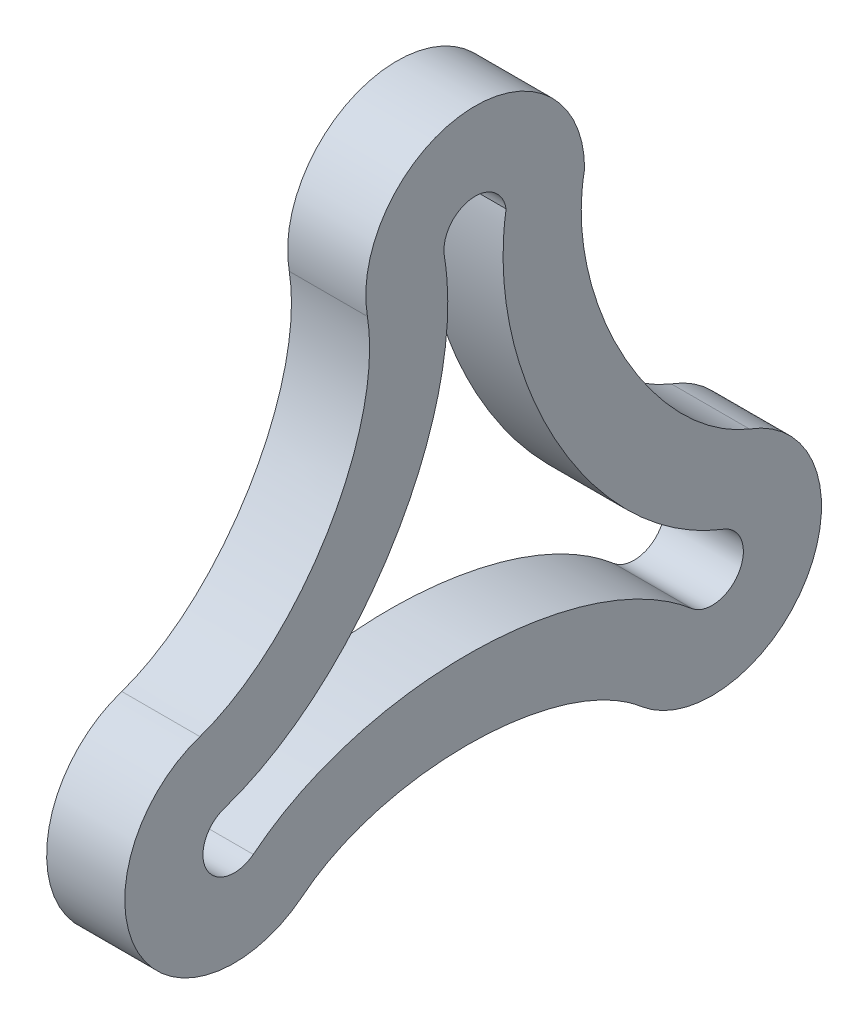
ISO-10303-21;
HEADER;
FILE_DESCRIPTION(('STEP AP214'),'2;1');
FILE_NAME('part.step','',(''),(''),'','','');
FILE_SCHEMA(('AUTOMOTIVE_DESIGN { 1 0 10303 214 1 1 1 1 }'));
ENDSEC;
DATA;
#1=APPLICATION_CONTEXT('core data for automotive mechanical design processes');
#2=APPLICATION_PROTOCOL_DEFINITION('international standard','automotive_design',2000,#1);
#3=PRODUCT_CONTEXT('',#1,'mechanical');
#4=PRODUCT('Part','Part','',(#3));
#5=PRODUCT_RELATED_PRODUCT_CATEGORY('part','',(#4));
#6=PRODUCT_DEFINITION_FORMATION('','',#4);
#7=PRODUCT_DEFINITION_CONTEXT('part definition',#1,'design');
#8=PRODUCT_DEFINITION('design','',#6,#7);
#9=PRODUCT_DEFINITION_SHAPE('','',#8);
#10=(LENGTH_UNIT() NAMED_UNIT(*) SI_UNIT(.MILLI.,.METRE.));
#11=(NAMED_UNIT(*) PLANE_ANGLE_UNIT() SI_UNIT($,.RADIAN.));
#12=(NAMED_UNIT(*) SI_UNIT($,.STERADIAN.) SOLID_ANGLE_UNIT());
#13=UNCERTAINTY_MEASURE_WITH_UNIT(LENGTH_MEASURE(1.E-05),#10,'distance_accuracy_value','');
#14=(GEOMETRIC_REPRESENTATION_CONTEXT(3) GLOBAL_UNCERTAINTY_ASSIGNED_CONTEXT((#13)) GLOBAL_UNIT_ASSIGNED_CONTEXT((#10,
#11,#12)) REPRESENTATION_CONTEXT('',''));
#15=CARTESIAN_POINT('',(0.,0.,0.));
#16=DIRECTION('',(0.,0.,1.));
#17=DIRECTION('',(1.,0.,0.));
#18=AXIS2_PLACEMENT_3D('',#15,#16,#17);
#19=CARTESIAN_POINT('',(10.,-17.4999999999999,-30.3108891324554));
#20=DIRECTION('',(1.,0.,0.));
#21=DIRECTION('',(0.,0.,-1.));
#22=AXIS2_PLACEMENT_3D('',#19,#20,#21);
#23=PLANE('',#22);
#24=CARTESIAN_POINT('',(10.,-17.4999999999999,-30.3108891324554));
#25=DIRECTION('',(1.,0.,0.));
#26=DIRECTION('',(0.,0.,-1.));
#27=AXIS2_PLACEMENT_3D('',#24,#25,#26);
#28=CIRCLE('',#27,14.);
#29=CARTESIAN_POINT('',(10.,-28.2246222036657,-21.311862596844));
#30=VERTEX_POINT('',#29);
#31=CARTESIAN_POINT('',(10.,-4.34430330899716,-35.0991711390147));
#32=VERTEX_POINT('',#31);
#33=EDGE_CURVE('E286',#30,#32,#28,.T.);
#34=ORIENTED_EDGE('',*,*,#33,.T.);
#35=CARTESIAN_POINT('',(10.,-4.34430330899717,-35.0991711390147));
#36=CARTESIAN_POINT('',(10.,0.730320455063931,-22.4095702220826));
#37=CARTESIAN_POINT('',(10.,21.6219834654,-11.2059972480785));
#38=CARTESIAN_POINT('',(10.,35.,-14.));
#39=B_SPLINE_CURVE_WITH_KNOTS('',3,(#35,#36,#37,#38),.UNSPECIFIED.,.F.,.F.,(4,4),(0.,1.),.UNSPECIFIED.);
#40=CARTESIAN_POINT('',(10.,35.,-14.));
#41=VERTEX_POINT('',#40);
#42=EDGE_CURVE('E318',#32,#41,#39,.T.);
#43=ORIENTED_EDGE('',*,*,#42,.T.);
#44=CARTESIAN_POINT('',(10.,35.,0.));
#45=DIRECTION('',(1.,0.,0.));
#46=DIRECTION('',(0.,0.,-1.));
#47=AXIS2_PLACEMENT_3D('',#44,#45,#46);
#48=CIRCLE('',#47,14.);
#49=CARTESIAN_POINT('',(10.,32.5689255126631,13.7873085421709));
#50=VERTEX_POINT('',#49);
#51=EDGE_CURVE('E305',#41,#50,#48,.T.);
#52=ORIENTED_EDGE('',*,*,#51,.T.);
#53=CARTESIAN_POINT('',(10.,-3.27085917525937,35.2154265364205));
#54=CARTESIAN_POINT('',(10.,1.20683735372193,22.303106389672));
#55=CARTESIAN_POINT('',(10.,19.0752286803663,11.6198391477293));
#56=CARTESIAN_POINT('',(10.,32.5689255126631,13.7873085421709));
#57=B_SPLINE_CURVE_WITH_KNOTS('',3,(#53,#54,#55,#56),.UNSPECIFIED.,.F.,.F.,(4,4),(0.,1.),.UNSPECIFIED.);
#58=CARTESIAN_POINT('',(10.,-3.27085917525937,35.2154265364205));
#59=VERTEX_POINT('',#58);
#60=EDGE_CURVE('E317',#59,#50,#57,.T.);
#61=ORIENTED_EDGE('',*,*,#60,.F.);
#62=CARTESIAN_POINT('',(10.,-16.5665898468168,30.8309601025876));
#63=DIRECTION('',(1.,0.,0.));
#64=DIRECTION('',(0.,0.,-1.));
#65=AXIS2_PLACEMENT_3D('',#62,#63,#64);
#66=CIRCLE('',#65,14.);
#67=CARTESIAN_POINT('',(10.,-27.56091400873,22.1635016387257));
#68=VERTEX_POINT('',#67);
#69=EDGE_CURVE('E255',#59,#68,#66,.T.);
#70=ORIENTED_EDGE('',*,*,#69,.T.);
#71=CARTESIAN_POINT('',(10.,-27.56091400873,22.1635016387257));
#72=CARTESIAN_POINT('',(10.,-18.9369820350699,11.5613520882118));
#73=CARTESIAN_POINT('',(10.,-19.2810731992745,-10.9779035789346));
#74=CARTESIAN_POINT('',(10.,-28.2246222036657,-21.311862596844));
#75=B_SPLINE_CURVE_WITH_KNOTS('',3,(#71,#72,#73,#74),.UNSPECIFIED.,.F.,.F.,(4,4),(0.,1.),.UNSPECIFIED.);
#76=EDGE_CURVE('E248',#68,#30,#75,.T.);
#77=ORIENTED_EDGE('',*,*,#76,.T.);
#78=EDGE_LOOP('',(#34,#43,#52,#61,#70,#77));
#79=FACE_BOUND('',#78,.T.);
#80=CARTESIAN_POINT('',(10.,-13.7052692722452,-31.5758075898408));
#81=CARTESIAN_POINT('',(10.,-13.5874261705025,-31.2811292055005));
#82=CARTESIAN_POINT('',(10.,-13.4682761810974,-30.9872777788818));
#83=CARTESIAN_POINT('',(10.,-13.2184869421537,-30.4068449708491));
#84=CARTESIAN_POINT('',(10.,-13.089187261214,-30.1194159522368));
#85=CARTESIAN_POINT('',(10.,-12.6886548150519,-29.2651229197161));
#86=CARTESIAN_POINT('',(10.,-12.4048049911812,-28.7062425867111));
#87=CARTESIAN_POINT('',(10.,-11.5067548924121,-27.0590257331627));
#88=CARTESIAN_POINT('',(10.,-10.84623330075,-25.999999896066));
#89=CARTESIAN_POINT('',(10.,-9.41738617719187,-23.9501631904281));
#90=CARTESIAN_POINT('',(10.,-8.64900229934688,-22.9593892413824));
#91=CARTESIAN_POINT('',(10.,-7.42348885495161,-21.5193809720151));
#92=CARTESIAN_POINT('',(10.,-7.00185447212498,-21.0461438813988));
#93=CARTESIAN_POINT('',(10.,-6.14287553165541,-20.1225468862931));
#94=CARTESIAN_POINT('',(10.,-5.70494021205501,-19.6713984582847));
#95=CARTESIAN_POINT('',(10.,-3.47602794125339,-17.4651318210425));
#96=CARTESIAN_POINT('',(10.,-1.56915187125181,-15.8561603901757));
#97=CARTESIAN_POINT('',(10.,1.44455982104537,-13.6361349405478));
#98=CARTESIAN_POINT('',(10.,2.47505132772029,-12.9288123162899));
#99=CARTESIAN_POINT('',(10.,4.05832959636734,-11.9151669405874));
#100=CARTESIAN_POINT('',(10.,4.59236202819255,-11.585195304149));
#101=CARTESIAN_POINT('',(10.,5.67293994000162,-10.941030767943));
#102=CARTESIAN_POINT('',(10.,6.22037791384543,-10.626358791773));
#103=CARTESIAN_POINT('',(10.,8.97451841022677,-9.10065630520394));
#104=CARTESIAN_POINT('',(10.,11.2342999253311,-8.02825132753051));
#105=CARTESIAN_POINT('',(10.,15.8684741057094,-6.18414459023827));
#106=CARTESIAN_POINT('',(10.,18.2426643794832,-5.41191181967238));
#107=CARTESIAN_POINT('',(10.,21.9061436763009,-4.52168692911069));
#108=CARTESIAN_POINT('',(10.,23.149488575624,-4.26962483275659));
#109=CARTESIAN_POINT('',(10.,25.6329949348202,-3.87613333368429));
#110=CARTESIAN_POINT('',(10.,26.8765673735458,-3.73346968841901));
#111=CARTESIAN_POINT('',(10.,29.3677535157308,-3.56827926976113));
#112=CARTESIAN_POINT('',(10.,30.6153649776108,-3.54568585972204));
#113=CARTESIAN_POINT('',(10.,33.1152291104769,-3.63847078375298));
#114=CARTESIAN_POINT('',(10.,34.3674770834453,-3.7537094572949));
#115=CARTESIAN_POINT('',(10.,35.622494125599,-3.95126575461519));
#116=B_SPLINE_CURVE_WITH_KNOTS('',3,(#80,#81,#82,#83,#84,#85,#86,#87,#88,#89,#90,#91,#92,#93,
#94,#95,#96,#97,#98,#99,#100,#101,#102,#103,#104,#105,#106,#107,#108,#109,#110,#111,#112,#113,
#114,#115),.UNSPECIFIED.,.F.,.F.,(4,2,2,2,2,2,2,2,2,2,2,2,2,2,2,2,2,4),(0.,0.0156249999999999,
0.0312499999999999,0.0624999999999999,0.125,0.1875,0.21875,0.25,0.375,0.4375,0.46875,0.5,0.625,
0.75,0.8125,0.875,0.9375,1.),.UNSPECIFIED.);
#117=CARTESIAN_POINT('',(10.,-13.7052692722452,-31.5758075898408));
#118=VERTEX_POINT('',#117);
#119=CARTESIAN_POINT('',(10.,35.622494125599,-3.95126575461519));
#120=VERTEX_POINT('',#119);
#121=EDGE_CURVE('E202',#118,#120,#116,.T.);
#122=ORIENTED_EDGE('',*,*,#121,.F.);
#123=CARTESIAN_POINT('',(10.,-17.4999999999999,-30.3108891324554));
#124=DIRECTION('',(1.,0.,0.));
#125=DIRECTION('',(0.,0.,-1.));
#126=AXIS2_PLACEMENT_3D('',#123,#124,#125);
#127=CIRCLE('',#126,4.);
#128=CARTESIAN_POINT('',(10.,-20.5936737407594,-27.7753058098775));
#129=VERTEX_POINT('',#128);
#130=EDGE_CURVE('E194',#129,#118,#127,.T.);
#131=ORIENTED_EDGE('',*,*,#130,.F.);
#132=CARTESIAN_POINT('',(10.,-19.7362218405777,28.3909943191949));
#133=CARTESIAN_POINT('',(10.,-18.9389145172402,27.4035076018071));
#134=CARTESIAN_POINT('',(10.,-18.2152920064089,26.3772814997736));
#135=CARTESIAN_POINT('',(10.,-16.893290998247,24.2589829448976));
#136=CARTESIAN_POINT('',(10.,-16.2950248439182,23.1668514283402));
#137=CARTESIAN_POINT('',(10.,-15.2092160835599,20.9243760990818));
#138=CARTESIAN_POINT('',(10.,-14.7217263120189,19.7740045089392));
#139=CARTESIAN_POINT('',(10.,-13.8478224334519,17.4201213543122));
#140=CARTESIAN_POINT('',(10.,-13.4607731890551,16.2126291843441));
#141=CARTESIAN_POINT('',(10.,-12.4587129290554,12.5832798578116));
#142=CARTESIAN_POINT('',(10.,-11.9918108184128,10.13497447388));
#143=CARTESIAN_POINT('',(10.,-11.3960017744614,5.19007001430639));
#144=CARTESIAN_POINT('',(10.,-11.2676573885535,2.69336129936687));
#145=CARTESIAN_POINT('',(10.,-11.3445899209126,-2.34760780342556));
#146=CARTESIAN_POINT('',(10.,-11.5490508115374,-4.83849144421632));
#147=CARTESIAN_POINT('',(10.,-12.2948635088509,-9.76018281717416));
#148=CARTESIAN_POINT('',(10.,-12.8356758023513,-12.1910867577679));
#149=CARTESIAN_POINT('',(10.,-13.7609661499659,-15.1852648439058));
#150=CARTESIAN_POINT('',(10.,-13.9586622088413,-15.7818467978336));
#151=CARTESIAN_POINT('',(10.,-14.3811200976377,-16.9701842152421));
#152=CARTESIAN_POINT('',(10.,-14.6057464166481,-17.5612990935115));
#153=CARTESIAN_POINT('',(10.,-15.3155422227981,-19.3089144906857));
#154=CARTESIAN_POINT('',(10.,-15.8384817686497,-20.4455226953782));
#155=CARTESIAN_POINT('',(10.,-16.9932872852116,-22.6563979178249));
#156=CARTESIAN_POINT('',(10.,-17.6251027310442,-23.7306938521696));
#157=CARTESIAN_POINT('',(10.,-19.0118523586382,-25.8088219363171));
#158=CARTESIAN_POINT('',(10.,-19.7666788532751,-26.8127157180257));
#159=CARTESIAN_POINT('',(10.,-20.5936737407594,-27.7753058098775));
#160=B_SPLINE_CURVE_WITH_KNOTS('',3,(#132,#133,#134,#135,#136,#137,#138,#139,#140,#141,#142,
#143,#144,#145,#146,#147,#148,#149,#150,#151,#152,#153,#154,#155,#156,#157,#158,#159),
.UNSPECIFIED.,.F.,.F.,(4,2,2,2,2,2,2,2,2,2,2,2,2,4),(0.,0.0625,0.125,0.1875,0.25,0.375,0.5,
0.625,0.75,0.78125,0.8125,0.875,0.9375,1.),.UNSPECIFIED.);
#161=CARTESIAN_POINT('',(10.,-19.7362218405777,28.3909943191949));
#162=VERTEX_POINT('',#161);
#163=EDGE_CURVE('E348',#162,#129,#160,.T.);
#164=ORIENTED_EDGE('',*,*,#163,.F.);
#165=CARTESIAN_POINT('',(10.,-16.5665898468168,30.8309601025876));
#166=DIRECTION('',(1.,0.,0.));
#167=DIRECTION('',(0.,0.,-1.));
#168=AXIS2_PLACEMENT_3D('',#165,#166,#167);
#169=CIRCLE('',#168,4.);
#170=CARTESIAN_POINT('',(10.,-12.7514923672908,32.0330546170557));
#171=VERTEX_POINT('',#170);
#172=EDGE_CURVE('E381',#171,#162,#169,.T.);
#173=ORIENTED_EDGE('',*,*,#172,.F.);
#174=CARTESIAN_POINT('',(10.,-12.7514923672908,32.0330546170557));
#175=CARTESIAN_POINT('',(10.,-12.5482065358327,31.4468398702333));
#176=CARTESIAN_POINT('',(10.,-12.3317614082213,30.8680948806678));
#177=CARTESIAN_POINT('',(10.,-11.8647636751303,29.7299657075673));
#178=CARTESIAN_POINT('',(10.,-11.6158342946796,29.1696601148022));
#179=CARTESIAN_POINT('',(10.,-10.8255081795343,27.5134572795555));
#180=CARTESIAN_POINT('',(10.,-10.2407073697815,26.4421979736984));
#181=CARTESIAN_POINT('',(10.,-8.96610989970284,24.3592793214071));
#182=CARTESIAN_POINT('',(10.,-8.27627923600239,23.3476392766857));
#183=CARTESIAN_POINT('',(10.,-6.79844815972391,21.3800843708354));
#184=CARTESIAN_POINT('',(10.,-6.00796920776748,20.422169604364));
#185=CARTESIAN_POINT('',(10.,-3.54451683968055,17.6799653542965));
#186=CARTESIAN_POINT('',(10.,-1.76776735111077,16.0064434777541));
#187=CARTESIAN_POINT('',(10.,1.07218618201035,13.6972133099663));
#188=CARTESIAN_POINT('',(10.,2.04830285892622,12.961355068118));
#189=CARTESIAN_POINT('',(10.,3.55592885222555,11.907536069427));
#190=CARTESIAN_POINT('',(10.,4.06572915694267,11.5646100793356));
#191=CARTESIAN_POINT('',(10.,5.09992148368445,10.8955384865642));
#192=CARTESIAN_POINT('',(10.,5.62511375104993,10.5689505705102));
#193=CARTESIAN_POINT('',(10.,8.26890950668344,8.98966977178995));
#194=CARTESIAN_POINT('',(10.,10.4516400001605,7.88808838450245));
#195=CARTESIAN_POINT('',(10.,14.9542623755349,6.01285247963076));
#196=CARTESIAN_POINT('',(10.,17.2739559899554,5.23872394210704));
#197=CARTESIAN_POINT('',(10.,20.2738745993184,4.51086535482948));
#198=CARTESIAN_POINT('',(10.,20.878420025379,4.37765441628988));
#199=CARTESIAN_POINT('',(10.,22.0857486138527,4.13917175307562));
#200=CARTESIAN_POINT('',(10.,22.6900009007586,4.03352769763858));
#201=CARTESIAN_POINT('',(10.,24.5045671236393,3.75843686425796));
#202=CARTESIAN_POINT('',(10.,25.716684835144,3.63070222886217));
#203=CARTESIAN_POINT('',(10.,28.1461008506974,3.49503368222912));
#204=CARTESIAN_POINT('',(10.,29.3633972696921,3.48705617929199));
#205=CARTESIAN_POINT('',(10.,31.1936512411382,3.57474308273423));
#206=CARTESIAN_POINT('',(10.,31.8044558498974,3.62062086505208));
#207=CARTESIAN_POINT('',(10.,33.0276011544735,3.747898301046));
#208=CARTESIAN_POINT('',(10.,33.6400228653645,3.83117142082494));
#209=CARTESIAN_POINT('',(10.,34.2531020813194,3.92964928448718));
#210=B_SPLINE_CURVE_WITH_KNOTS('',3,(#174,#175,#176,#177,#178,#179,#180,#181,#182,#183,#184,
#185,#186,#187,#188,#189,#190,#191,#192,#193,#194,#195,#196,#197,#198,#199,#200,#201,#202,#203,
#204,#205,#206,#207,#208,#209),.UNSPECIFIED.,.F.,.F.,(4,2,2,2,2,2,2,2,2,2,2,2,2,2,2,2,2,4),(0.,
0.0312500000000002,0.0625000000000003,0.125,0.187500000000001,0.250000000000001,
0.375000000000001,0.437500000000001,0.468750000000001,0.500000000000001,0.625000000000001,
0.750000000000001,0.781250000000001,0.812500000000001,0.875000000000001,0.9375,0.96875,1.),.UNSPECIFIED.);
#211=CARTESIAN_POINT('',(10.,34.2531020813194,3.92964928448718));
#212=VERTEX_POINT('',#211);
#213=EDGE_CURVE('E217',#171,#212,#210,.T.);
#214=ORIENTED_EDGE('',*,*,#213,.T.);
#215=CARTESIAN_POINT('',(10.,35.,0.));
#216=DIRECTION('',(1.,0.,0.));
#217=DIRECTION('',(0.,0.,-1.));
#218=AXIS2_PLACEMENT_3D('',#215,#216,#217);
#219=CIRCLE('',#218,4.);
#220=EDGE_CURVE('E215',#120,#212,#219,.T.);
#221=ORIENTED_EDGE('',*,*,#220,.F.);
#222=EDGE_LOOP('',(#122,#131,#164,#173,#214,#221));
#223=FACE_BOUND('',#222,.T.);
#224=ADVANCED_FACE('F105',(#79,#223),#23,.T.);
#225=CARTESIAN_POINT('',(0.,-17.4999999999999,-30.3108891324554));
#226=DIRECTION('',(1.,0.,0.));
#227=DIRECTION('',(0.,0.,-1.));
#228=AXIS2_PLACEMENT_3D('',#225,#226,#227);
#229=PLANE('',#228);
#230=CARTESIAN_POINT('',(0.,-17.4999999999999,-30.3108891324554));
#231=DIRECTION('',(1.,0.,0.));
#232=DIRECTION('',(0.,0.,-1.));
#233=AXIS2_PLACEMENT_3D('',#230,#231,#232);
#234=CIRCLE('',#233,14.);
#235=CARTESIAN_POINT('',(0.,-28.2246222036657,-21.311862596844));
#236=VERTEX_POINT('',#235);
#237=CARTESIAN_POINT('',(0.,-4.34430330899716,-35.0991711390147));
#238=VERTEX_POINT('',#237);
#239=EDGE_CURVE('E210',#236,#238,#234,.T.);
#240=ORIENTED_EDGE('',*,*,#239,.F.);
#241=CARTESIAN_POINT('',(0.,-27.56091400873,22.1635016387257));
#242=CARTESIAN_POINT('',(0.,-18.9369820350699,11.5613520882118));
#243=CARTESIAN_POINT('',(0.,-19.2810731992745,-10.9779035789346));
#244=CARTESIAN_POINT('',(0.,-28.2246222036657,-21.311862596844));
#245=B_SPLINE_CURVE_WITH_KNOTS('',3,(#241,#242,#243,#244),.UNSPECIFIED.,.F.,.F.,(4,4),(0.,1.),.UNSPECIFIED.);
#246=CARTESIAN_POINT('',(0.,-27.56091400873,22.1635016387257));
#247=VERTEX_POINT('',#246);
#248=EDGE_CURVE('E282',#247,#236,#245,.T.);
#249=ORIENTED_EDGE('',*,*,#248,.F.);
#250=CARTESIAN_POINT('',(0.,-16.5665898468168,30.8309601025876));
#251=DIRECTION('',(1.,0.,0.));
#252=DIRECTION('',(0.,0.,-1.));
#253=AXIS2_PLACEMENT_3D('',#250,#251,#252);
#254=CIRCLE('',#253,14.);
#255=CARTESIAN_POINT('',(0.,-3.27085917525937,35.2154265364205));
#256=VERTEX_POINT('',#255);
#257=EDGE_CURVE('E277',#256,#247,#254,.T.);
#258=ORIENTED_EDGE('',*,*,#257,.F.);
#259=CARTESIAN_POINT('',(0.,-3.27085917525937,35.2154265364205));
#260=CARTESIAN_POINT('',(0.,1.20683735372193,22.303106389672));
#261=CARTESIAN_POINT('',(0.,19.0752286803663,11.6198391477293));
#262=CARTESIAN_POINT('',(0.,32.5689255126631,13.7873085421709));
#263=B_SPLINE_CURVE_WITH_KNOTS('',3,(#259,#260,#261,#262),.UNSPECIFIED.,.F.,.F.,(4,4),(0.,1.),.UNSPECIFIED.);
#264=CARTESIAN_POINT('',(0.,32.5689255126631,13.7873085421709));
#265=VERTEX_POINT('',#264);
#266=EDGE_CURVE('E272',#256,#265,#263,.T.);
#267=ORIENTED_EDGE('',*,*,#266,.T.);
#268=CARTESIAN_POINT('',(0.,35.,0.));
#269=DIRECTION('',(1.,0.,0.));
#270=DIRECTION('',(0.,0.,-1.));
#271=AXIS2_PLACEMENT_3D('',#268,#269,#270);
#272=CIRCLE('',#271,14.);
#273=CARTESIAN_POINT('',(0.,35.,-14.));
#274=VERTEX_POINT('',#273);
#275=EDGE_CURVE('E266',#274,#265,#272,.T.);
#276=ORIENTED_EDGE('',*,*,#275,.F.);
#277=CARTESIAN_POINT('',(0.,-4.34430330899717,-35.0991711390147));
#278=CARTESIAN_POINT('',(0.,0.730320455063931,-22.4095702220826));
#279=CARTESIAN_POINT('',(0.,21.6219834654,-11.2059972480785));
#280=CARTESIAN_POINT('',(0.,35.,-14.));
#281=B_SPLINE_CURVE_WITH_KNOTS('',3,(#277,#278,#279,#280),.UNSPECIFIED.,.F.,.F.,(4,4),(0.,1.),.UNSPECIFIED.);
#282=EDGE_CURVE('E262',#238,#274,#281,.T.);
#283=ORIENTED_EDGE('',*,*,#282,.F.);
#284=EDGE_LOOP('',(#240,#249,#258,#267,#276,#283));
#285=FACE_BOUND('',#284,.T.);
#286=CARTESIAN_POINT('',(0.,-17.4999999999999,-30.3108891324554));
#287=DIRECTION('',(1.,0.,0.));
#288=DIRECTION('',(0.,0.,-1.));
#289=AXIS2_PLACEMENT_3D('',#286,#287,#288);
#290=CIRCLE('',#289,4.);
#291=CARTESIAN_POINT('',(0.,-20.5936737407594,-27.7753058098775));
#292=VERTEX_POINT('',#291);
#293=CARTESIAN_POINT('',(0.,-13.7052692722452,-31.5758075898408));
#294=VERTEX_POINT('',#293);
#295=EDGE_CURVE('E128',#292,#294,#290,.T.);
#296=ORIENTED_EDGE('',*,*,#295,.T.);
#297=CARTESIAN_POINT('',(0.,-13.7052692722452,-31.5758075898408));
#298=CARTESIAN_POINT('',(0.,-13.5874261705025,-31.2811292055005));
#299=CARTESIAN_POINT('',(0.,-13.4682761810974,-30.9872777788818));
#300=CARTESIAN_POINT('',(0.,-13.2184869421537,-30.4068449708491));
#301=CARTESIAN_POINT('',(0.,-13.089187261214,-30.1194159522368));
#302=CARTESIAN_POINT('',(0.,-12.6886548150519,-29.2651229197161));
#303=CARTESIAN_POINT('',(0.,-12.4048049911812,-28.7062425867111));
#304=CARTESIAN_POINT('',(0.,-11.5067548924121,-27.0590257331627));
#305=CARTESIAN_POINT('',(0.,-10.84623330075,-25.999999896066));
#306=CARTESIAN_POINT('',(0.,-9.41738617719187,-23.9501631904281));
#307=CARTESIAN_POINT('',(0.,-8.64900229934688,-22.9593892413824));
#308=CARTESIAN_POINT('',(0.,-7.42348885495161,-21.5193809720151));
#309=CARTESIAN_POINT('',(0.,-7.00185447212498,-21.0461438813988));
#310=CARTESIAN_POINT('',(0.,-6.14287553165541,-20.1225468862931));
#311=CARTESIAN_POINT('',(0.,-5.70494021205501,-19.6713984582847));
#312=CARTESIAN_POINT('',(0.,-3.47602794125339,-17.4651318210425));
#313=CARTESIAN_POINT('',(0.,-1.56915187125181,-15.8561603901757));
#314=CARTESIAN_POINT('',(0.,1.44455982104537,-13.6361349405478));
#315=CARTESIAN_POINT('',(0.,2.47505132772029,-12.9288123162899));
#316=CARTESIAN_POINT('',(0.,4.05832959636734,-11.9151669405874));
#317=CARTESIAN_POINT('',(0.,4.59236202819255,-11.585195304149));
#318=CARTESIAN_POINT('',(0.,5.67293994000162,-10.941030767943));
#319=CARTESIAN_POINT('',(0.,6.22037791384543,-10.626358791773));
#320=CARTESIAN_POINT('',(0.,8.97451841022677,-9.10065630520394));
#321=CARTESIAN_POINT('',(0.,11.2342999253311,-8.02825132753051));
#322=CARTESIAN_POINT('',(0.,15.8684741057094,-6.18414459023827));
#323=CARTESIAN_POINT('',(0.,18.2426643794832,-5.41191181967238));
#324=CARTESIAN_POINT('',(0.,21.9061436763009,-4.52168692911069));
#325=CARTESIAN_POINT('',(0.,23.149488575624,-4.26962483275659));
#326=CARTESIAN_POINT('',(0.,25.6329949348202,-3.87613333368429));
#327=CARTESIAN_POINT('',(0.,26.8765673735458,-3.73346968841901));
#328=CARTESIAN_POINT('',(0.,29.3677535157308,-3.56827926976113));
#329=CARTESIAN_POINT('',(0.,30.6153649776108,-3.54568585972204));
#330=CARTESIAN_POINT('',(0.,33.1152291104769,-3.63847078375298));
#331=CARTESIAN_POINT('',(0.,34.3674770834453,-3.7537094572949));
#332=CARTESIAN_POINT('',(0.,35.622494125599,-3.95126575461519));
#333=B_SPLINE_CURVE_WITH_KNOTS('',3,(#297,#298,#299,#300,#301,#302,#303,#304,#305,#306,#307,
#308,#309,#310,#311,#312,#313,#314,#315,#316,#317,#318,#319,#320,#321,#322,#323,#324,#325,#326,
#327,#328,#329,#330,#331,#332),.UNSPECIFIED.,.F.,.F.,(4,2,2,2,2,2,2,2,2,2,2,2,2,2,2,2,2,4),(0.,
0.0156249999999999,0.0312499999999999,0.0624999999999999,0.125,0.1875,0.21875,0.25,0.375,0.4375,
0.46875,0.5,0.625,0.75,0.8125,0.875,0.9375,1.),.UNSPECIFIED.);
#334=CARTESIAN_POINT('',(0.,35.622494125599,-3.95126575461519));
#335=VERTEX_POINT('',#334);
#336=EDGE_CURVE('E209',#294,#335,#333,.T.);
#337=ORIENTED_EDGE('',*,*,#336,.T.);
#338=CARTESIAN_POINT('',(0.,35.,0.));
#339=DIRECTION('',(1.,0.,0.));
#340=DIRECTION('',(0.,0.,-1.));
#341=AXIS2_PLACEMENT_3D('',#338,#339,#340);
#342=CIRCLE('',#341,4.);
#343=CARTESIAN_POINT('',(0.,34.2531020813194,3.92964928448718));
#344=VERTEX_POINT('',#343);
#345=EDGE_CURVE('E364',#335,#344,#342,.T.);
#346=ORIENTED_EDGE('',*,*,#345,.T.);
#347=CARTESIAN_POINT('',(0.,-12.7514923672908,32.0330546170557));
#348=CARTESIAN_POINT('',(0.,-12.5482065358327,31.4468398702333));
#349=CARTESIAN_POINT('',(0.,-12.3317614082213,30.8680948806678));
#350=CARTESIAN_POINT('',(0.,-11.8647636751303,29.7299657075673));
#351=CARTESIAN_POINT('',(0.,-11.6158342946796,29.1696601148022));
#352=CARTESIAN_POINT('',(0.,-10.8255081795343,27.5134572795555));
#353=CARTESIAN_POINT('',(0.,-10.2407073697815,26.4421979736984));
#354=CARTESIAN_POINT('',(0.,-8.96610989970284,24.3592793214071));
#355=CARTESIAN_POINT('',(0.,-8.27627923600239,23.3476392766857));
#356=CARTESIAN_POINT('',(0.,-6.79844815972391,21.3800843708354));
#357=CARTESIAN_POINT('',(0.,-6.00796920776748,20.422169604364));
#358=CARTESIAN_POINT('',(0.,-3.54451683968055,17.6799653542965));
#359=CARTESIAN_POINT('',(0.,-1.76776735111077,16.0064434777541));
#360=CARTESIAN_POINT('',(0.,1.07218618201035,13.6972133099663));
#361=CARTESIAN_POINT('',(0.,2.04830285892622,12.961355068118));
#362=CARTESIAN_POINT('',(0.,3.55592885222555,11.907536069427));
#363=CARTESIAN_POINT('',(0.,4.06572915694267,11.5646100793356));
#364=CARTESIAN_POINT('',(0.,5.09992148368445,10.8955384865642));
#365=CARTESIAN_POINT('',(0.,5.62511375104993,10.5689505705102));
#366=CARTESIAN_POINT('',(0.,8.26890950668344,8.98966977178995));
#367=CARTESIAN_POINT('',(0.,10.4516400001605,7.88808838450245));
#368=CARTESIAN_POINT('',(0.,14.9542623755349,6.01285247963076));
#369=CARTESIAN_POINT('',(0.,17.2739559899554,5.23872394210704));
#370=CARTESIAN_POINT('',(0.,20.2738745993184,4.51086535482948));
#371=CARTESIAN_POINT('',(0.,20.878420025379,4.37765441628988));
#372=CARTESIAN_POINT('',(0.,22.0857486138527,4.13917175307562));
#373=CARTESIAN_POINT('',(0.,22.6900009007586,4.03352769763858));
#374=CARTESIAN_POINT('',(0.,24.5045671236393,3.75843686425796));
#375=CARTESIAN_POINT('',(0.,25.716684835144,3.63070222886217));
#376=CARTESIAN_POINT('',(0.,28.1461008506974,3.49503368222912));
#377=CARTESIAN_POINT('',(0.,29.3633972696921,3.48705617929199));
#378=CARTESIAN_POINT('',(0.,31.1936512411382,3.57474308273423));
#379=CARTESIAN_POINT('',(0.,31.8044558498974,3.62062086505208));
#380=CARTESIAN_POINT('',(0.,33.0276011544735,3.747898301046));
#381=CARTESIAN_POINT('',(0.,33.6400228653645,3.83117142082494));
#382=CARTESIAN_POINT('',(0.,34.2531020813194,3.92964928448718));
#383=B_SPLINE_CURVE_WITH_KNOTS('',3,(#347,#348,#349,#350,#351,#352,#353,#354,#355,#356,#357,
#358,#359,#360,#361,#362,#363,#364,#365,#366,#367,#368,#369,#370,#371,#372,#373,#374,#375,#376,
#377,#378,#379,#380,#381,#382),.UNSPECIFIED.,.F.,.F.,(4,2,2,2,2,2,2,2,2,2,2,2,2,2,2,2,2,4),(0.,
0.0312500000000002,0.0625000000000003,0.125,0.187500000000001,0.250000000000001,
0.375000000000001,0.437500000000001,0.468750000000001,0.500000000000001,0.625000000000001,
0.750000000000001,0.781250000000001,0.812500000000001,0.875000000000001,0.9375,0.96875,1.),.UNSPECIFIED.);
#384=CARTESIAN_POINT('',(0.,-12.7514923672908,32.0330546170557));
#385=VERTEX_POINT('',#384);
#386=EDGE_CURVE('E359',#385,#344,#383,.T.);
#387=ORIENTED_EDGE('',*,*,#386,.F.);
#388=CARTESIAN_POINT('',(0.,-16.5665898468168,30.8309601025876));
#389=DIRECTION('',(1.,0.,0.));
#390=DIRECTION('',(0.,0.,-1.));
#391=AXIS2_PLACEMENT_3D('',#388,#389,#390);
#392=CIRCLE('',#391,4.);
#393=CARTESIAN_POINT('',(0.,-19.7362218405777,28.3909943191949));
#394=VERTEX_POINT('',#393);
#395=EDGE_CURVE('E353',#385,#394,#392,.T.);
#396=ORIENTED_EDGE('',*,*,#395,.T.);
#397=CARTESIAN_POINT('',(0.,-19.7362218405777,28.3909943191949));
#398=CARTESIAN_POINT('',(0.,-18.9389145172402,27.4035076018071));
#399=CARTESIAN_POINT('',(0.,-18.2152920064089,26.3772814997736));
#400=CARTESIAN_POINT('',(0.,-16.893290998247,24.2589829448976));
#401=CARTESIAN_POINT('',(0.,-16.2950248439182,23.1668514283402));
#402=CARTESIAN_POINT('',(0.,-15.2092160835599,20.9243760990818));
#403=CARTESIAN_POINT('',(0.,-14.7217263120189,19.7740045089392));
#404=CARTESIAN_POINT('',(0.,-13.8478224334519,17.4201213543122));
#405=CARTESIAN_POINT('',(0.,-13.4607731890551,16.2126291843441));
#406=CARTESIAN_POINT('',(0.,-12.4587129290554,12.5832798578116));
#407=CARTESIAN_POINT('',(0.,-11.9918108184128,10.13497447388));
#408=CARTESIAN_POINT('',(0.,-11.3960017744614,5.19007001430639));
#409=CARTESIAN_POINT('',(0.,-11.2676573885535,2.69336129936687));
#410=CARTESIAN_POINT('',(0.,-11.3445899209126,-2.34760780342556));
#411=CARTESIAN_POINT('',(0.,-11.5490508115374,-4.83849144421632));
#412=CARTESIAN_POINT('',(0.,-12.2948635088509,-9.76018281717416));
#413=CARTESIAN_POINT('',(0.,-12.8356758023513,-12.1910867577679));
#414=CARTESIAN_POINT('',(0.,-13.7609661499659,-15.1852648439058));
#415=CARTESIAN_POINT('',(0.,-13.9586622088413,-15.7818467978336));
#416=CARTESIAN_POINT('',(0.,-14.3811200976377,-16.9701842152421));
#417=CARTESIAN_POINT('',(0.,-14.6057464166481,-17.5612990935115));
#418=CARTESIAN_POINT('',(0.,-15.3155422227981,-19.3089144906857));
#419=CARTESIAN_POINT('',(0.,-15.8384817686497,-20.4455226953782));
#420=CARTESIAN_POINT('',(0.,-16.9932872852116,-22.6563979178249));
#421=CARTESIAN_POINT('',(0.,-17.6251027310442,-23.7306938521696));
#422=CARTESIAN_POINT('',(0.,-19.0118523586382,-25.8088219363171));
#423=CARTESIAN_POINT('',(0.,-19.7666788532751,-26.8127157180257));
#424=CARTESIAN_POINT('',(0.,-20.5936737407594,-27.7753058098775));
#425=B_SPLINE_CURVE_WITH_KNOTS('',3,(#397,#398,#399,#400,#401,#402,#403,#404,#405,#406,#407,
#408,#409,#410,#411,#412,#413,#414,#415,#416,#417,#418,#419,#420,#421,#422,#423,#424),
.UNSPECIFIED.,.F.,.F.,(4,2,2,2,2,2,2,2,2,2,2,2,2,4),(0.,0.0625,0.125,0.1875,0.25,0.375,0.5,
0.625,0.75,0.78125,0.8125,0.875,0.9375,1.),.UNSPECIFIED.);
#426=EDGE_CURVE('E203',#394,#292,#425,.T.);
#427=ORIENTED_EDGE('',*,*,#426,.T.);
#428=EDGE_LOOP('',(#296,#337,#346,#387,#396,#427));
#429=FACE_BOUND('',#428,.T.);
#430=ADVANCED_FACE('F237',(#285,#429),#229,.F.);
#431=CARTESIAN_POINT('',(10.,-17.4999999999999,-30.3108891324554));
#432=DIRECTION('',(-1.,0.,0.));
#433=DIRECTION('',(0.,0.,1.));
#434=AXIS2_PLACEMENT_3D('',#431,#432,#433);
#435=CYLINDRICAL_SURFACE('',#434,14.);
#436=ORIENTED_EDGE('',*,*,#239,.T.);
#437=DIRECTION('',(-1.,0.,0.));
#438=VECTOR('',#437,1.);
#439=CARTESIAN_POINT('',(10.,-4.34430330899716,-35.0991711390147));
#440=LINE('',#439,#438);
#441=EDGE_CURVE('E12',#32,#238,#440,.T.);
#442=ORIENTED_EDGE('',*,*,#441,.F.);
#443=ORIENTED_EDGE('',*,*,#33,.F.);
#444=DIRECTION('',(-1.,0.,0.));
#445=VECTOR('',#444,1.);
#446=CARTESIAN_POINT('',(10.,-28.2246222036657,-21.311862596844));
#447=LINE('',#446,#445);
#448=EDGE_CURVE('E254',#30,#236,#447,.T.);
#449=ORIENTED_EDGE('',*,*,#448,.T.);
#450=EDGE_LOOP('',(#436,#442,#443,#449));
#451=FACE_BOUND('',#450,.T.);
#452=ADVANCED_FACE('F107',(#451),#435,.T.);
#453=DIRECTION('',(-1.,0.,0.));
#454=VECTOR('',#453,1.);
#455=SURFACE_OF_LINEAR_EXTRUSION('',#39,#454);
#456=ORIENTED_EDGE('',*,*,#282,.T.);
#457=DIRECTION('',(-1.,0.,0.));
#458=VECTOR('',#457,1.);
#459=CARTESIAN_POINT('',(10.,35.,-14.));
#460=LINE('',#459,#458);
#461=EDGE_CURVE('E113',#41,#274,#460,.T.);
#462=ORIENTED_EDGE('',*,*,#461,.F.);
#463=ORIENTED_EDGE('',*,*,#42,.F.);
#464=ORIENTED_EDGE('',*,*,#441,.T.);
#465=EDGE_LOOP('',(#456,#462,#463,#464));
#466=FACE_BOUND('',#465,.T.);
#467=ADVANCED_FACE('F330',(#466),#455,.F.);
#468=CARTESIAN_POINT('',(10.,35.,0.));
#469=DIRECTION('',(-1.,0.,0.));
#470=DIRECTION('',(0.,0.,1.));
#471=AXIS2_PLACEMENT_3D('',#468,#469,#470);
#472=CYLINDRICAL_SURFACE('',#471,14.);
#473=ORIENTED_EDGE('',*,*,#275,.T.);
#474=DIRECTION('',(-1.,0.,0.));
#475=VECTOR('',#474,1.);
#476=CARTESIAN_POINT('',(10.,32.5689255126631,13.7873085421709));
#477=LINE('',#476,#475);
#478=EDGE_CURVE('E297',#50,#265,#477,.T.);
#479=ORIENTED_EDGE('',*,*,#478,.F.);
#480=ORIENTED_EDGE('',*,*,#51,.F.);
#481=ORIENTED_EDGE('',*,*,#461,.T.);
#482=EDGE_LOOP('',(#473,#479,#480,#481));
#483=FACE_BOUND('',#482,.T.);
#484=ADVANCED_FACE('F303',(#483),#472,.T.);
#485=DIRECTION('',(-1.,0.,0.));
#486=VECTOR('',#485,1.);
#487=SURFACE_OF_LINEAR_EXTRUSION('',#57,#486);
#488=ORIENTED_EDGE('',*,*,#266,.F.);
#489=DIRECTION('',(-1.,0.,0.));
#490=VECTOR('',#489,1.);
#491=CARTESIAN_POINT('',(10.,-3.27085917525937,35.2154265364205));
#492=LINE('',#491,#490);
#493=EDGE_CURVE('E295',#59,#256,#492,.T.);
#494=ORIENTED_EDGE('',*,*,#493,.F.);
#495=ORIENTED_EDGE('',*,*,#60,.T.);
#496=ORIENTED_EDGE('',*,*,#478,.T.);
#497=EDGE_LOOP('',(#488,#494,#495,#496));
#498=FACE_BOUND('',#497,.T.);
#499=ADVANCED_FACE('F313',(#498),#487,.T.);
#500=CARTESIAN_POINT('',(10.,-16.5665898468168,30.8309601025876));
#501=DIRECTION('',(-1.,0.,0.));
#502=DIRECTION('',(0.,0.,1.));
#503=AXIS2_PLACEMENT_3D('',#500,#501,#502);
#504=CYLINDRICAL_SURFACE('',#503,14.);
#505=ORIENTED_EDGE('',*,*,#257,.T.);
#506=DIRECTION('',(-1.,0.,0.));
#507=VECTOR('',#506,1.);
#508=CARTESIAN_POINT('',(10.,-27.56091400873,22.1635016387257));
#509=LINE('',#508,#507);
#510=EDGE_CURVE('E292',#68,#247,#509,.T.);
#511=ORIENTED_EDGE('',*,*,#510,.F.);
#512=ORIENTED_EDGE('',*,*,#69,.F.);
#513=ORIENTED_EDGE('',*,*,#493,.T.);
#514=EDGE_LOOP('',(#505,#511,#512,#513));
#515=FACE_BOUND('',#514,.T.);
#516=ADVANCED_FACE('F245',(#515),#504,.T.);
#517=DIRECTION('',(-1.,0.,0.));
#518=VECTOR('',#517,1.);
#519=SURFACE_OF_LINEAR_EXTRUSION('',#75,#518);
#520=ORIENTED_EDGE('',*,*,#248,.T.);
#521=ORIENTED_EDGE('',*,*,#448,.F.);
#522=ORIENTED_EDGE('',*,*,#76,.F.);
#523=ORIENTED_EDGE('',*,*,#510,.T.);
#524=EDGE_LOOP('',(#520,#521,#522,#523));
#525=FACE_BOUND('',#524,.T.);
#526=ADVANCED_FACE('F234',(#525),#519,.F.);
#527=CARTESIAN_POINT('',(10.,-17.4999999999999,-30.3108891324554));
#528=DIRECTION('',(-1.,0.,0.));
#529=DIRECTION('',(0.,0.,1.));
#530=AXIS2_PLACEMENT_3D('',#527,#528,#529);
#531=CYLINDRICAL_SURFACE('',#530,4.);
#532=ORIENTED_EDGE('',*,*,#295,.F.);
#533=DIRECTION('',(-1.,0.,0.));
#534=VECTOR('',#533,1.);
#535=CARTESIAN_POINT('',(10.,-20.5936737407594,-27.7753058098775));
#536=LINE('',#535,#534);
#537=EDGE_CURVE('E198',#129,#292,#536,.T.);
#538=ORIENTED_EDGE('',*,*,#537,.F.);
#539=ORIENTED_EDGE('',*,*,#130,.T.);
#540=DIRECTION('',(-1.,0.,0.));
#541=VECTOR('',#540,1.);
#542=CARTESIAN_POINT('',(10.,-13.7052692722452,-31.5758075898408));
#543=LINE('',#542,#541);
#544=EDGE_CURVE('E197',#118,#294,#543,.T.);
#545=ORIENTED_EDGE('',*,*,#544,.T.);
#546=EDGE_LOOP('',(#532,#538,#539,#545));
#547=FACE_BOUND('',#546,.T.);
#548=ADVANCED_FACE('F196',(#547),#531,.F.);
#549=DIRECTION('',(-1.,0.,0.));
#550=VECTOR('',#549,1.);
#551=SURFACE_OF_LINEAR_EXTRUSION('',#116,#550);
#552=ORIENTED_EDGE('',*,*,#336,.F.);
#553=ORIENTED_EDGE('',*,*,#544,.F.);
#554=ORIENTED_EDGE('',*,*,#121,.T.);
#555=DIRECTION('',(-1.,0.,0.));
#556=VECTOR('',#555,1.);
#557=CARTESIAN_POINT('',(10.,35.622494125599,-3.95126575461519));
#558=LINE('',#557,#556);
#559=EDGE_CURVE('E211',#120,#335,#558,.T.);
#560=ORIENTED_EDGE('',*,*,#559,.T.);
#561=EDGE_LOOP('',(#552,#553,#554,#560));
#562=FACE_BOUND('',#561,.T.);
#563=ADVANCED_FACE('F206',(#562),#551,.T.);
#564=CARTESIAN_POINT('',(10.,35.,0.));
#565=DIRECTION('',(-1.,0.,0.));
#566=DIRECTION('',(0.,0.,1.));
#567=AXIS2_PLACEMENT_3D('',#564,#565,#566);
#568=CYLINDRICAL_SURFACE('',#567,4.);
#569=ORIENTED_EDGE('',*,*,#345,.F.);
#570=ORIENTED_EDGE('',*,*,#559,.F.);
#571=ORIENTED_EDGE('',*,*,#220,.T.);
#572=DIRECTION('',(-1.,0.,0.));
#573=VECTOR('',#572,1.);
#574=CARTESIAN_POINT('',(10.,34.2531020813194,3.92964928448718));
#575=LINE('',#574,#573);
#576=EDGE_CURVE('E342',#212,#344,#575,.T.);
#577=ORIENTED_EDGE('',*,*,#576,.T.);
#578=EDGE_LOOP('',(#569,#570,#571,#577));
#579=FACE_BOUND('',#578,.T.);
#580=ADVANCED_FACE('F230',(#579),#568,.F.);
#581=DIRECTION('',(-1.,0.,0.));
#582=VECTOR('',#581,1.);
#583=SURFACE_OF_LINEAR_EXTRUSION('',#210,#582);
#584=ORIENTED_EDGE('',*,*,#386,.T.);
#585=ORIENTED_EDGE('',*,*,#576,.F.);
#586=ORIENTED_EDGE('',*,*,#213,.F.);
#587=DIRECTION('',(-1.,0.,0.));
#588=VECTOR('',#587,1.);
#589=CARTESIAN_POINT('',(10.,-12.7514923672908,32.0330546170557));
#590=LINE('',#589,#588);
#591=EDGE_CURVE('E344',#171,#385,#590,.T.);
#592=ORIENTED_EDGE('',*,*,#591,.T.);
#593=EDGE_LOOP('',(#584,#585,#586,#592));
#594=FACE_BOUND('',#593,.T.);
#595=ADVANCED_FACE('F391',(#594),#583,.F.);
#596=CARTESIAN_POINT('',(10.,-16.5665898468168,30.8309601025876));
#597=DIRECTION('',(-1.,0.,0.));
#598=DIRECTION('',(0.,0.,1.));
#599=AXIS2_PLACEMENT_3D('',#596,#597,#598);
#600=CYLINDRICAL_SURFACE('',#599,4.);
#601=ORIENTED_EDGE('',*,*,#395,.F.);
#602=ORIENTED_EDGE('',*,*,#591,.F.);
#603=ORIENTED_EDGE('',*,*,#172,.T.);
#604=DIRECTION('',(-1.,0.,0.));
#605=VECTOR('',#604,1.);
#606=CARTESIAN_POINT('',(10.,-19.7362218405777,28.3909943191949));
#607=LINE('',#606,#605);
#608=EDGE_CURVE('E120',#162,#394,#607,.T.);
#609=ORIENTED_EDGE('',*,*,#608,.T.);
#610=EDGE_LOOP('',(#601,#602,#603,#609));
#611=FACE_BOUND('',#610,.T.);
#612=ADVANCED_FACE('F389',(#611),#600,.F.);
#613=DIRECTION('',(-1.,0.,0.));
#614=VECTOR('',#613,1.);
#615=SURFACE_OF_LINEAR_EXTRUSION('',#160,#614);
#616=ORIENTED_EDGE('',*,*,#426,.F.);
#617=ORIENTED_EDGE('',*,*,#608,.F.);
#618=ORIENTED_EDGE('',*,*,#163,.T.);
#619=ORIENTED_EDGE('',*,*,#537,.T.);
#620=EDGE_LOOP('',(#616,#617,#618,#619));
#621=FACE_BOUND('',#620,.T.);
#622=ADVANCED_FACE('F386',(#621),#615,.T.);
#623=CLOSED_SHELL('',(#224,#430,#452,#467,#484,#499,#516,#526,#548,#563,#580,#595,#612,#622));
#624=MANIFOLD_SOLID_BREP('B2',#623);
#625=ADVANCED_BREP_SHAPE_REPRESENTATION('',(#18,#624),#14);
#626=SHAPE_DEFINITION_REPRESENTATION(#9,#625);
ENDSEC;
END-ISO-10303-21;
